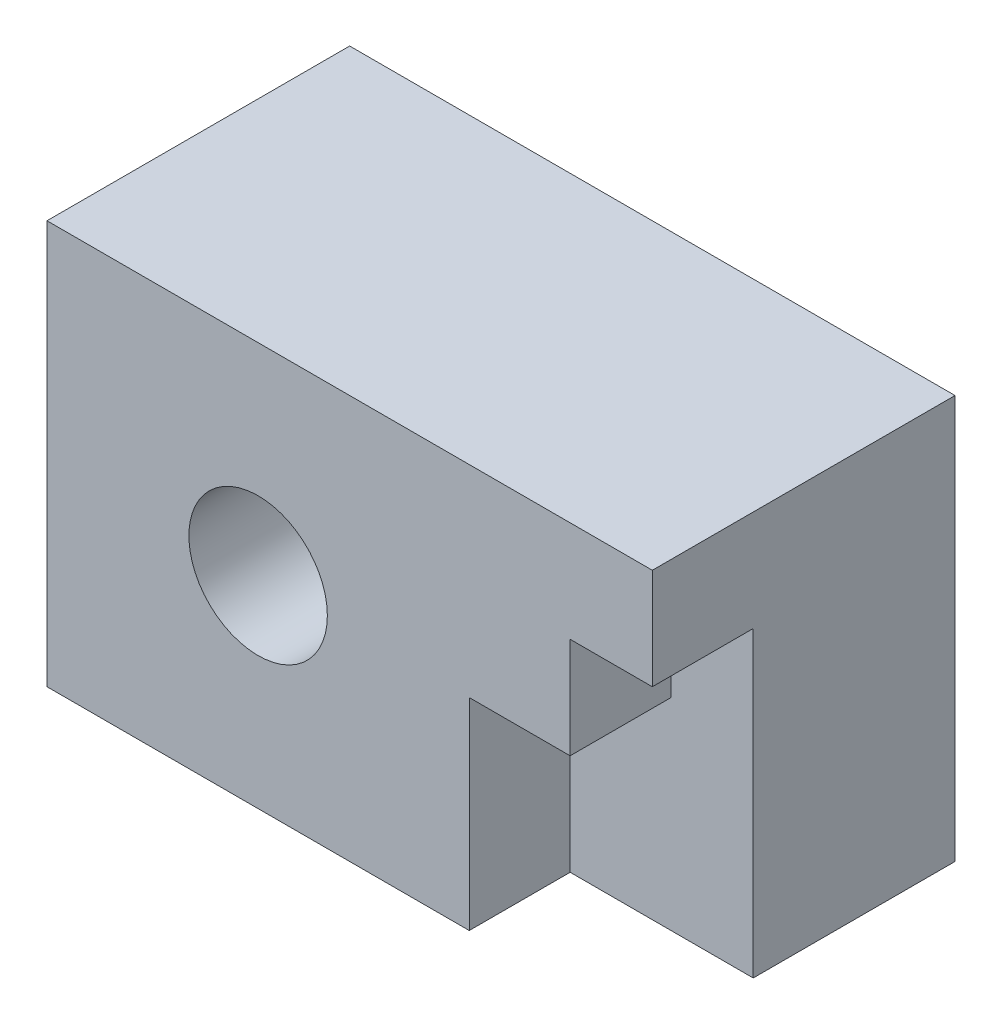
ISO-10303-21;
HEADER;
FILE_DESCRIPTION(('STEP AP214'),'2;1');
FILE_NAME('part.step','',(''),(''),'','','');
FILE_SCHEMA(('AUTOMOTIVE_DESIGN { 1 0 10303 214 1 1 1 1 }'));
ENDSEC;
DATA;
#1=APPLICATION_CONTEXT('core data for automotive mechanical design processes');
#2=APPLICATION_PROTOCOL_DEFINITION('international standard','automotive_design',2000,#1);
#3=PRODUCT_CONTEXT('',#1,'mechanical');
#4=PRODUCT('Part','Part','',(#3));
#5=PRODUCT_RELATED_PRODUCT_CATEGORY('part','',(#4));
#6=PRODUCT_DEFINITION_FORMATION('','',#4);
#7=PRODUCT_DEFINITION_CONTEXT('part definition',#1,'design');
#8=PRODUCT_DEFINITION('design','',#6,#7);
#9=PRODUCT_DEFINITION_SHAPE('','',#8);
#10=(LENGTH_UNIT() NAMED_UNIT(*) SI_UNIT(.MILLI.,.METRE.));
#11=(NAMED_UNIT(*) PLANE_ANGLE_UNIT() SI_UNIT($,.RADIAN.));
#12=(NAMED_UNIT(*) SI_UNIT($,.STERADIAN.) SOLID_ANGLE_UNIT());
#13=UNCERTAINTY_MEASURE_WITH_UNIT(LENGTH_MEASURE(1.E-05),#10,'distance_accuracy_value','');
#14=(GEOMETRIC_REPRESENTATION_CONTEXT(3) GLOBAL_UNCERTAINTY_ASSIGNED_CONTEXT((#13)) GLOBAL_UNIT_ASSIGNED_CONTEXT((#10,
#11,#12)) REPRESENTATION_CONTEXT('',''));
#15=CARTESIAN_POINT('',(0.,0.,0.));
#16=DIRECTION('',(0.,0.,1.));
#17=DIRECTION('',(1.,0.,0.));
#18=AXIS2_PLACEMENT_3D('',#15,#16,#17);
#19=CARTESIAN_POINT('',(0.,0.,30.));
#20=DIRECTION('',(1.,0.,0.));
#21=DIRECTION('',(0.,0.,-1.));
#22=AXIS2_PLACEMENT_3D('',#19,#20,#21);
#23=PLANE('',#22);
#24=DIRECTION('',(0.,-1.,0.));
#25=VECTOR('',#24,1.);
#26=CARTESIAN_POINT('',(0.,0.,0.));
#27=LINE('',#26,#25);
#28=CARTESIAN_POINT('',(0.,40.,0.));
#29=VERTEX_POINT('',#28);
#30=CARTESIAN_POINT('',(0.,0.,0.));
#31=VERTEX_POINT('',#30);
#32=EDGE_CURVE('E153',#29,#31,#27,.T.);
#33=ORIENTED_EDGE('',*,*,#32,.T.);
#34=DIRECTION('',(0.,0.,-1.));
#35=VECTOR('',#34,1.);
#36=CARTESIAN_POINT('',(0.,0.,30.));
#37=LINE('',#36,#35);
#38=CARTESIAN_POINT('',(0.,0.,30.));
#39=VERTEX_POINT('',#38);
#40=EDGE_CURVE('E11',#39,#31,#37,.T.);
#41=ORIENTED_EDGE('',*,*,#40,.F.);
#42=DIRECTION('',(0.,-1.,0.));
#43=VECTOR('',#42,1.);
#44=CARTESIAN_POINT('',(0.,0.,30.));
#45=LINE('',#44,#43);
#46=CARTESIAN_POINT('',(0.,40.,30.));
#47=VERTEX_POINT('',#46);
#48=EDGE_CURVE('E149',#47,#39,#45,.T.);
#49=ORIENTED_EDGE('',*,*,#48,.F.);
#50=DIRECTION('',(0.,0.,-1.));
#51=VECTOR('',#50,1.);
#52=CARTESIAN_POINT('',(0.,40.,30.));
#53=LINE('',#52,#51);
#54=EDGE_CURVE('E144',#47,#29,#53,.T.);
#55=ORIENTED_EDGE('',*,*,#54,.T.);
#56=EDGE_LOOP('',(#33,#41,#49,#55));
#57=FACE_BOUND('',#56,.T.);
#58=ADVANCED_FACE('F39',(#57),#23,.F.);
#59=CARTESIAN_POINT('',(0.,0.,30.));
#60=DIRECTION('',(0.,1.,0.));
#61=DIRECTION('',(0.,0.,1.));
#62=AXIS2_PLACEMENT_3D('',#59,#60,#61);
#63=PLANE('',#62);
#64=DIRECTION('',(1.,0.,0.));
#65=VECTOR('',#64,1.);
#66=CARTESIAN_POINT('',(60.,0.,20.));
#67=LINE('',#66,#65);
#68=CARTESIAN_POINT('',(41.8532676013924,0.,20.));
#69=VERTEX_POINT('',#68);
#70=CARTESIAN_POINT('',(60.,0.,20.));
#71=VERTEX_POINT('',#70);
#72=EDGE_CURVE('E122',#69,#71,#67,.T.);
#73=ORIENTED_EDGE('',*,*,#72,.F.);
#74=DIRECTION('',(0.,0.,1.));
#75=VECTOR('',#74,1.);
#76=CARTESIAN_POINT('',(41.8532676013924,0.,20.));
#77=LINE('',#76,#75);
#78=CARTESIAN_POINT('',(41.8532676013924,0.,30.));
#79=VERTEX_POINT('',#78);
#80=EDGE_CURVE('E156',#69,#79,#77,.T.);
#81=ORIENTED_EDGE('',*,*,#80,.T.);
#82=DIRECTION('',(1.,0.,0.));
#83=VECTOR('',#82,1.);
#84=CARTESIAN_POINT('',(0.,0.,30.));
#85=LINE('',#84,#83);
#86=EDGE_CURVE('E89',#39,#79,#85,.T.);
#87=ORIENTED_EDGE('',*,*,#86,.F.);
#88=ORIENTED_EDGE('',*,*,#40,.T.);
#89=DIRECTION('',(1.,0.,0.));
#90=VECTOR('',#89,1.);
#91=CARTESIAN_POINT('',(0.,0.,0.));
#92=LINE('',#91,#90);
#93=CARTESIAN_POINT('',(60.,0.,0.));
#94=VERTEX_POINT('',#93);
#95=EDGE_CURVE('E140',#31,#94,#92,.T.);
#96=ORIENTED_EDGE('',*,*,#95,.T.);
#97=DIRECTION('',(0.,0.,-1.));
#98=VECTOR('',#97,1.);
#99=CARTESIAN_POINT('',(60.,0.,30.));
#100=LINE('',#99,#98);
#101=EDGE_CURVE('E47',#71,#94,#100,.T.);
#102=ORIENTED_EDGE('',*,*,#101,.F.);
#103=EDGE_LOOP('',(#73,#81,#87,#88,#96,#102));
#104=FACE_BOUND('',#103,.T.);
#105=ADVANCED_FACE('F139',(#104),#63,.F.);
#106=CARTESIAN_POINT('',(60.,0.,30.));
#107=DIRECTION('',(-1.,0.,0.));
#108=DIRECTION('',(0.,0.,1.));
#109=AXIS2_PLACEMENT_3D('',#106,#107,#108);
#110=PLANE('',#109);
#111=DIRECTION('',(0.,1.,0.));
#112=VECTOR('',#111,1.);
#113=CARTESIAN_POINT('',(60.,0.,30.));
#114=LINE('',#113,#112);
#115=CARTESIAN_POINT('',(60.,30.,30.));
#116=VERTEX_POINT('',#115);
#117=CARTESIAN_POINT('',(60.,40.,30.));
#118=VERTEX_POINT('',#117);
#119=EDGE_CURVE('E158',#116,#118,#114,.T.);
#120=ORIENTED_EDGE('',*,*,#119,.F.);
#121=DIRECTION('',(0.,0.,1.));
#122=VECTOR('',#121,1.);
#123=CARTESIAN_POINT('',(60.,30.,20.));
#124=LINE('',#123,#122);
#125=CARTESIAN_POINT('',(60.,30.,20.));
#126=VERTEX_POINT('',#125);
#127=EDGE_CURVE('E54',#126,#116,#124,.T.);
#128=ORIENTED_EDGE('',*,*,#127,.F.);
#129=DIRECTION('',(0.,1.,0.));
#130=VECTOR('',#129,1.);
#131=CARTESIAN_POINT('',(60.,30.,20.));
#132=LINE('',#131,#130);
#133=EDGE_CURVE('E126',#71,#126,#132,.T.);
#134=ORIENTED_EDGE('',*,*,#133,.F.);
#135=ORIENTED_EDGE('',*,*,#101,.T.);
#136=DIRECTION('',(0.,1.,0.));
#137=VECTOR('',#136,1.);
#138=CARTESIAN_POINT('',(60.,0.,0.));
#139=LINE('',#138,#137);
#140=CARTESIAN_POINT('',(60.,40.,0.));
#141=VERTEX_POINT('',#140);
#142=EDGE_CURVE('E150',#94,#141,#139,.T.);
#143=ORIENTED_EDGE('',*,*,#142,.T.);
#144=DIRECTION('',(0.,0.,-1.));
#145=VECTOR('',#144,1.);
#146=CARTESIAN_POINT('',(60.,40.,30.));
#147=LINE('',#146,#145);
#148=EDGE_CURVE('E142',#118,#141,#147,.T.);
#149=ORIENTED_EDGE('',*,*,#148,.F.);
#150=EDGE_LOOP('',(#120,#128,#134,#135,#143,#149));
#151=FACE_BOUND('',#150,.T.);
#152=ADVANCED_FACE('F135',(#151),#110,.F.);
#153=CARTESIAN_POINT('',(0.,40.,30.));
#154=DIRECTION('',(0.,-1.,0.));
#155=DIRECTION('',(0.,0.,-1.));
#156=AXIS2_PLACEMENT_3D('',#153,#154,#155);
#157=PLANE('',#156);
#158=DIRECTION('',(-1.,0.,0.));
#159=VECTOR('',#158,1.);
#160=CARTESIAN_POINT('',(0.,40.,0.));
#161=LINE('',#160,#159);
#162=EDGE_CURVE('E83',#141,#29,#161,.T.);
#163=ORIENTED_EDGE('',*,*,#162,.T.);
#164=ORIENTED_EDGE('',*,*,#54,.F.);
#165=DIRECTION('',(-1.,0.,0.));
#166=VECTOR('',#165,1.);
#167=CARTESIAN_POINT('',(0.,40.,30.));
#168=LINE('',#167,#166);
#169=EDGE_CURVE('E63',#118,#47,#168,.T.);
#170=ORIENTED_EDGE('',*,*,#169,.F.);
#171=ORIENTED_EDGE('',*,*,#148,.T.);
#172=EDGE_LOOP('',(#163,#164,#170,#171));
#173=FACE_BOUND('',#172,.T.);
#174=ADVANCED_FACE('F205',(#173),#157,.F.);
#175=CARTESIAN_POINT('',(0.,0.,30.));
#176=DIRECTION('',(0.,0.,-1.));
#177=DIRECTION('',(-1.,0.,0.));
#178=AXIS2_PLACEMENT_3D('',#175,#176,#177);
#179=PLANE('',#178);
#180=CARTESIAN_POINT('',(20.9266338006962,20.,30.));
#181=DIRECTION('',(0.,0.,1.));
#182=DIRECTION('',(1.,0.,0.));
#183=AXIS2_PLACEMENT_3D('',#180,#181,#182);
#184=CIRCLE('',#183,6.86355038619202);
#185=CARTESIAN_POINT('',(27.7901841868882,20.,30.));
#186=VERTEX_POINT('',#185);
#187=EDGE_CURVE('E186',#186,#186,#184,.T.);
#188=ORIENTED_EDGE('',*,*,#187,.F.);
#189=EDGE_LOOP('',(#188));
#190=FACE_BOUND('',#189,.T.);
#191=ORIENTED_EDGE('',*,*,#86,.T.);
#192=DIRECTION('',(0.,-1.,0.));
#193=VECTOR('',#192,1.);
#194=CARTESIAN_POINT('',(41.8532676013924,0.,30.));
#195=LINE('',#194,#193);
#196=CARTESIAN_POINT('',(41.8532676013924,20.,30.));
#197=VERTEX_POINT('',#196);
#198=EDGE_CURVE('E131',#197,#79,#195,.T.);
#199=ORIENTED_EDGE('',*,*,#198,.F.);
#200=DIRECTION('',(-1.,0.,0.));
#201=VECTOR('',#200,1.);
#202=CARTESIAN_POINT('',(41.8532676013924,20.,30.));
#203=LINE('',#202,#201);
#204=CARTESIAN_POINT('',(51.8532676013924,20.,30.));
#205=VERTEX_POINT('',#204);
#206=EDGE_CURVE('E171',#205,#197,#203,.T.);
#207=ORIENTED_EDGE('',*,*,#206,.F.);
#208=DIRECTION('',(0.,-1.,0.));
#209=VECTOR('',#208,1.);
#210=CARTESIAN_POINT('',(51.8532676013924,20.,30.));
#211=LINE('',#210,#209);
#212=CARTESIAN_POINT('',(51.8532676013924,30.,30.));
#213=VERTEX_POINT('',#212);
#214=EDGE_CURVE('E174',#213,#205,#211,.T.);
#215=ORIENTED_EDGE('',*,*,#214,.F.);
#216=DIRECTION('',(-1.,0.,0.));
#217=VECTOR('',#216,1.);
#218=CARTESIAN_POINT('',(51.8532676013924,30.,30.));
#219=LINE('',#218,#217);
#220=EDGE_CURVE('E177',#116,#213,#219,.T.);
#221=ORIENTED_EDGE('',*,*,#220,.F.);
#222=ORIENTED_EDGE('',*,*,#119,.T.);
#223=ORIENTED_EDGE('',*,*,#169,.T.);
#224=ORIENTED_EDGE('',*,*,#48,.T.);
#225=EDGE_LOOP('',(#191,#199,#207,#215,#221,#222,#223,#224));
#226=FACE_BOUND('',#225,.T.);
#227=ADVANCED_FACE('F199',(#190,#226),#179,.F.);
#228=CARTESIAN_POINT('',(0.,0.,0.));
#229=DIRECTION('',(0.,0.,-1.));
#230=DIRECTION('',(-1.,0.,0.));
#231=AXIS2_PLACEMENT_3D('',#228,#229,#230);
#232=PLANE('',#231);
#233=CARTESIAN_POINT('',(20.9266338006962,20.,0.));
#234=DIRECTION('',(0.,0.,-1.));
#235=DIRECTION('',(-1.,0.,0.));
#236=AXIS2_PLACEMENT_3D('',#233,#234,#235);
#237=CIRCLE('',#236,6.86355038619202);
#238=CARTESIAN_POINT('',(14.0630834145042,20.,0.));
#239=VERTEX_POINT('',#238);
#240=EDGE_CURVE('E42',#239,#239,#237,.T.);
#241=ORIENTED_EDGE('',*,*,#240,.F.);
#242=EDGE_LOOP('',(#241));
#243=FACE_BOUND('',#242,.T.);
#244=ORIENTED_EDGE('',*,*,#32,.F.);
#245=ORIENTED_EDGE('',*,*,#162,.F.);
#246=ORIENTED_EDGE('',*,*,#142,.F.);
#247=ORIENTED_EDGE('',*,*,#95,.F.);
#248=EDGE_LOOP('',(#244,#245,#246,#247));
#249=FACE_BOUND('',#248,.T.);
#250=ADVANCED_FACE('F195',(#243,#249),#232,.T.);
#251=CARTESIAN_POINT('',(41.8532676013924,0.,20.));
#252=DIRECTION('',(-1.,0.,0.));
#253=DIRECTION('',(0.,0.,1.));
#254=AXIS2_PLACEMENT_3D('',#251,#252,#253);
#255=PLANE('',#254);
#256=ORIENTED_EDGE('',*,*,#198,.T.);
#257=ORIENTED_EDGE('',*,*,#80,.F.);
#258=DIRECTION('',(0.,-1.,0.));
#259=VECTOR('',#258,1.);
#260=CARTESIAN_POINT('',(41.8532676013924,0.,20.));
#261=LINE('',#260,#259);
#262=CARTESIAN_POINT('',(41.8532676013924,20.,20.));
#263=VERTEX_POINT('',#262);
#264=EDGE_CURVE('E129',#263,#69,#261,.T.);
#265=ORIENTED_EDGE('',*,*,#264,.F.);
#266=DIRECTION('',(0.,0.,1.));
#267=VECTOR('',#266,1.);
#268=CARTESIAN_POINT('',(41.8532676013924,20.,20.));
#269=LINE('',#268,#267);
#270=EDGE_CURVE('E167',#263,#197,#269,.T.);
#271=ORIENTED_EDGE('',*,*,#270,.T.);
#272=EDGE_LOOP('',(#256,#257,#265,#271));
#273=FACE_BOUND('',#272,.T.);
#274=ADVANCED_FACE('F198',(#273),#255,.F.);
#275=CARTESIAN_POINT('',(41.8532676013924,20.,20.));
#276=DIRECTION('',(0.,1.,0.));
#277=DIRECTION('',(0.,0.,1.));
#278=AXIS2_PLACEMENT_3D('',#275,#276,#277);
#279=PLANE('',#278);
#280=ORIENTED_EDGE('',*,*,#206,.T.);
#281=ORIENTED_EDGE('',*,*,#270,.F.);
#282=DIRECTION('',(-1.,0.,0.));
#283=VECTOR('',#282,1.);
#284=CARTESIAN_POINT('',(41.8532676013924,20.,20.));
#285=LINE('',#284,#283);
#286=CARTESIAN_POINT('',(51.8532676013924,20.,20.));
#287=VERTEX_POINT('',#286);
#288=EDGE_CURVE('E180',#287,#263,#285,.T.);
#289=ORIENTED_EDGE('',*,*,#288,.F.);
#290=DIRECTION('',(0.,0.,1.));
#291=VECTOR('',#290,1.);
#292=CARTESIAN_POINT('',(51.8532676013924,20.,20.));
#293=LINE('',#292,#291);
#294=EDGE_CURVE('E165',#287,#205,#293,.T.);
#295=ORIENTED_EDGE('',*,*,#294,.T.);
#296=EDGE_LOOP('',(#280,#281,#289,#295));
#297=FACE_BOUND('',#296,.T.);
#298=ADVANCED_FACE('F217',(#297),#279,.F.);
#299=CARTESIAN_POINT('',(51.8532676013924,20.,20.));
#300=DIRECTION('',(-1.,0.,0.));
#301=DIRECTION('',(0.,0.,1.));
#302=AXIS2_PLACEMENT_3D('',#299,#300,#301);
#303=PLANE('',#302);
#304=ORIENTED_EDGE('',*,*,#214,.T.);
#305=ORIENTED_EDGE('',*,*,#294,.F.);
#306=DIRECTION('',(0.,-1.,0.));
#307=VECTOR('',#306,1.);
#308=CARTESIAN_POINT('',(51.8532676013924,20.,20.));
#309=LINE('',#308,#307);
#310=CARTESIAN_POINT('',(51.8532676013924,30.,20.));
#311=VERTEX_POINT('',#310);
#312=EDGE_CURVE('E182',#311,#287,#309,.T.);
#313=ORIENTED_EDGE('',*,*,#312,.F.);
#314=DIRECTION('',(0.,0.,1.));
#315=VECTOR('',#314,1.);
#316=CARTESIAN_POINT('',(51.8532676013924,30.,20.));
#317=LINE('',#316,#315);
#318=EDGE_CURVE('E163',#311,#213,#317,.T.);
#319=ORIENTED_EDGE('',*,*,#318,.T.);
#320=EDGE_LOOP('',(#304,#305,#313,#319));
#321=FACE_BOUND('',#320,.T.);
#322=ADVANCED_FACE('F212',(#321),#303,.F.);
#323=CARTESIAN_POINT('',(51.8532676013924,30.,20.));
#324=DIRECTION('',(0.,1.,0.));
#325=DIRECTION('',(0.,0.,1.));
#326=AXIS2_PLACEMENT_3D('',#323,#324,#325);
#327=PLANE('',#326);
#328=ORIENTED_EDGE('',*,*,#220,.T.);
#329=ORIENTED_EDGE('',*,*,#318,.F.);
#330=DIRECTION('',(-1.,0.,0.));
#331=VECTOR('',#330,1.);
#332=CARTESIAN_POINT('',(51.8532676013924,30.,20.));
#333=LINE('',#332,#331);
#334=EDGE_CURVE('E137',#126,#311,#333,.T.);
#335=ORIENTED_EDGE('',*,*,#334,.F.);
#336=ORIENTED_EDGE('',*,*,#127,.T.);
#337=EDGE_LOOP('',(#328,#329,#335,#336));
#338=FACE_BOUND('',#337,.T.);
#339=ADVANCED_FACE('F209',(#338),#327,.F.);
#340=CARTESIAN_POINT('',(0.,0.,20.));
#341=DIRECTION('',(0.,0.,-1.));
#342=DIRECTION('',(-1.,0.,0.));
#343=AXIS2_PLACEMENT_3D('',#340,#341,#342);
#344=PLANE('',#343);
#345=ORIENTED_EDGE('',*,*,#72,.T.);
#346=ORIENTED_EDGE('',*,*,#133,.T.);
#347=ORIENTED_EDGE('',*,*,#334,.T.);
#348=ORIENTED_EDGE('',*,*,#312,.T.);
#349=ORIENTED_EDGE('',*,*,#288,.T.);
#350=ORIENTED_EDGE('',*,*,#264,.T.);
#351=EDGE_LOOP('',(#345,#346,#347,#348,#349,#350));
#352=FACE_BOUND('',#351,.T.);
#353=ADVANCED_FACE('F124',(#352),#344,.F.);
#354=CARTESIAN_POINT('',(20.9266338006962,20.,-0.999999999999997));
#355=DIRECTION('',(0.,0.,1.));
#356=DIRECTION('',(1.,0.,0.));
#357=AXIS2_PLACEMENT_3D('',#354,#355,#356);
#358=CYLINDRICAL_SURFACE('',#357,6.86355038619202);
#359=ORIENTED_EDGE('',*,*,#240,.T.);
#360=EDGE_LOOP('',(#359));
#361=FACE_BOUND('',#360,.T.);
#362=ORIENTED_EDGE('',*,*,#187,.T.);
#363=EDGE_LOOP('',(#362));
#364=FACE_BOUND('',#363,.T.);
#365=ADVANCED_FACE('F193',(#361,#364),#358,.F.);
#366=CLOSED_SHELL('',(#58,#105,#152,#174,#227,#250,#274,#298,#322,#339,#353,#365));
#367=MANIFOLD_SOLID_BREP('B2',#366);
#368=ADVANCED_BREP_SHAPE_REPRESENTATION('',(#18,#367),#14);
#369=SHAPE_DEFINITION_REPRESENTATION(#9,#368);
ENDSEC;
END-ISO-10303-21;
